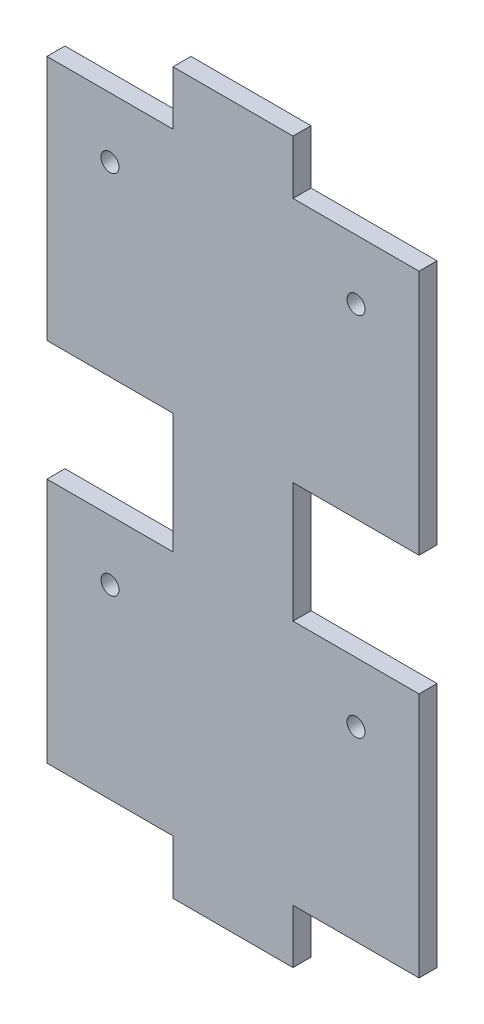
ISO-10303-21;
HEADER;
FILE_DESCRIPTION(('STEP AP214'),'2;1');
FILE_NAME('part.step','',(''),(''),'','','');
FILE_SCHEMA(('AUTOMOTIVE_DESIGN { 1 0 10303 214 1 1 1 1 }'));
ENDSEC;
DATA;
#1=APPLICATION_CONTEXT('core data for automotive mechanical design processes');
#2=APPLICATION_PROTOCOL_DEFINITION('international standard','automotive_design',2000,#1);
#3=PRODUCT_CONTEXT('',#1,'mechanical');
#4=PRODUCT('Part','Part','',(#3));
#5=PRODUCT_RELATED_PRODUCT_CATEGORY('part','',(#4));
#6=PRODUCT_DEFINITION_FORMATION('','',#4);
#7=PRODUCT_DEFINITION_CONTEXT('part definition',#1,'design');
#8=PRODUCT_DEFINITION('design','',#6,#7);
#9=PRODUCT_DEFINITION_SHAPE('','',#8);
#10=(LENGTH_UNIT() NAMED_UNIT(*) SI_UNIT(.MILLI.,.METRE.));
#11=(NAMED_UNIT(*) PLANE_ANGLE_UNIT() SI_UNIT($,.RADIAN.));
#12=(NAMED_UNIT(*) SI_UNIT($,.STERADIAN.) SOLID_ANGLE_UNIT());
#13=UNCERTAINTY_MEASURE_WITH_UNIT(LENGTH_MEASURE(1.E-05),#10,'distance_accuracy_value','');
#14=(GEOMETRIC_REPRESENTATION_CONTEXT(3) GLOBAL_UNCERTAINTY_ASSIGNED_CONTEXT((#13)) GLOBAL_UNIT_ASSIGNED_CONTEXT((#10,
#11,#12)) REPRESENTATION_CONTEXT('',''));
#15=CARTESIAN_POINT('',(0.,0.,0.));
#16=DIRECTION('',(0.,0.,1.));
#17=DIRECTION('',(1.,0.,0.));
#18=AXIS2_PLACEMENT_3D('',#15,#16,#17);
#19=CARTESIAN_POINT('',(31.,0.,3.));
#20=DIRECTION('',(-1.,0.,0.));
#21=DIRECTION('',(0.,0.,1.));
#22=AXIS2_PLACEMENT_3D('',#19,#20,#21);
#23=PLANE('',#22);
#24=DIRECTION('',(0.,1.,0.));
#25=VECTOR('',#24,1.);
#26=CARTESIAN_POINT('',(31.,0.,0.));
#27=LINE('',#26,#25);
#28=CARTESIAN_POINT('',(31.,13.4085885049134,0.));
#29=VERTEX_POINT('',#28);
#30=CARTESIAN_POINT('',(31.,54.4085885049134,0.));
#31=VERTEX_POINT('',#30);
#32=EDGE_CURVE('E221',#29,#31,#27,.T.);
#33=ORIENTED_EDGE('',*,*,#32,.T.);
#34=DIRECTION('',(0.,0.,-1.));
#35=VECTOR('',#34,1.);
#36=CARTESIAN_POINT('',(31.,54.4085885049134,3.));
#37=LINE('',#36,#35);
#38=CARTESIAN_POINT('',(31.,54.4085885049134,3.));
#39=VERTEX_POINT('',#38);
#40=EDGE_CURVE('E11',#39,#31,#37,.T.);
#41=ORIENTED_EDGE('',*,*,#40,.F.);
#42=DIRECTION('',(0.,1.,0.));
#43=VECTOR('',#42,1.);
#44=CARTESIAN_POINT('',(31.,0.,3.));
#45=LINE('',#44,#43);
#46=CARTESIAN_POINT('',(31.,13.4085885049134,3.));
#47=VERTEX_POINT('',#46);
#48=EDGE_CURVE('E362',#47,#39,#45,.T.);
#49=ORIENTED_EDGE('',*,*,#48,.F.);
#50=DIRECTION('',(0.,0.,-1.));
#51=VECTOR('',#50,1.);
#52=CARTESIAN_POINT('',(31.,13.4085885049134,3.));
#53=LINE('',#52,#51);
#54=EDGE_CURVE('E217',#47,#29,#53,.T.);
#55=ORIENTED_EDGE('',*,*,#54,.T.);
#56=EDGE_LOOP('',(#33,#41,#49,#55));
#57=FACE_BOUND('',#56,.T.);
#58=ADVANCED_FACE('F35',(#57),#23,.F.);
#59=CARTESIAN_POINT('',(0.,54.4085885049134,3.));
#60=DIRECTION('',(0.,-1.,0.));
#61=DIRECTION('',(1.,0.,0.));
#62=AXIS2_PLACEMENT_3D('',#59,#60,#61);
#63=PLANE('',#62);
#64=DIRECTION('',(-1.,0.,0.));
#65=VECTOR('',#64,1.);
#66=CARTESIAN_POINT('',(0.,54.4085885049134,0.));
#67=LINE('',#66,#65);
#68=CARTESIAN_POINT('',(10.,54.4085885049134,0.));
#69=VERTEX_POINT('',#68);
#70=EDGE_CURVE('E224',#31,#69,#67,.T.);
#71=ORIENTED_EDGE('',*,*,#70,.T.);
#72=DIRECTION('',(0.,0.,-1.));
#73=VECTOR('',#72,1.);
#74=CARTESIAN_POINT('',(10.,54.4085885049134,3.));
#75=LINE('',#74,#73);
#76=CARTESIAN_POINT('',(10.,54.4085885049134,3.));
#77=VERTEX_POINT('',#76);
#78=EDGE_CURVE('E44',#77,#69,#75,.T.);
#79=ORIENTED_EDGE('',*,*,#78,.F.);
#80=DIRECTION('',(-1.,0.,0.));
#81=VECTOR('',#80,1.);
#82=CARTESIAN_POINT('',(0.,54.4085885049134,3.));
#83=LINE('',#82,#81);
#84=EDGE_CURVE('E130',#39,#77,#83,.T.);
#85=ORIENTED_EDGE('',*,*,#84,.F.);
#86=ORIENTED_EDGE('',*,*,#40,.T.);
#87=EDGE_LOOP('',(#71,#79,#85,#86));
#88=FACE_BOUND('',#87,.T.);
#89=ADVANCED_FACE('F382',(#88),#63,.F.);
#90=CARTESIAN_POINT('',(10.,0.,3.));
#91=DIRECTION('',(-1.,0.,0.));
#92=DIRECTION('',(0.,0.,1.));
#93=AXIS2_PLACEMENT_3D('',#90,#91,#92);
#94=PLANE('',#93);
#95=DIRECTION('',(0.,1.,0.));
#96=VECTOR('',#95,1.);
#97=CARTESIAN_POINT('',(10.,0.,0.));
#98=LINE('',#97,#96);
#99=CARTESIAN_POINT('',(10.,63.4085885049134,0.));
#100=VERTEX_POINT('',#99);
#101=EDGE_CURVE('E226',#69,#100,#98,.T.);
#102=ORIENTED_EDGE('',*,*,#101,.T.);
#103=DIRECTION('',(0.,0.,-1.));
#104=VECTOR('',#103,1.);
#105=CARTESIAN_POINT('',(10.,63.4085885049134,3.));
#106=LINE('',#105,#104);
#107=CARTESIAN_POINT('',(10.,63.4085885049134,3.));
#108=VERTEX_POINT('',#107);
#109=EDGE_CURVE('E307',#108,#100,#106,.T.);
#110=ORIENTED_EDGE('',*,*,#109,.F.);
#111=DIRECTION('',(0.,1.,0.));
#112=VECTOR('',#111,1.);
#113=CARTESIAN_POINT('',(10.,0.,3.));
#114=LINE('',#113,#112);
#115=EDGE_CURVE('E195',#77,#108,#114,.T.);
#116=ORIENTED_EDGE('',*,*,#115,.F.);
#117=ORIENTED_EDGE('',*,*,#78,.T.);
#118=EDGE_LOOP('',(#102,#110,#116,#117));
#119=FACE_BOUND('',#118,.T.);
#120=ADVANCED_FACE('F313',(#119),#94,.F.);
#121=CARTESIAN_POINT('',(0.,63.4085885049134,3.));
#122=DIRECTION('',(0.,-1.,0.));
#123=DIRECTION('',(0.,0.,-1.));
#124=AXIS2_PLACEMENT_3D('',#121,#122,#123);
#125=PLANE('',#124);
#126=DIRECTION('',(-1.,0.,0.));
#127=VECTOR('',#126,1.);
#128=CARTESIAN_POINT('',(0.,63.4085885049134,0.));
#129=LINE('',#128,#127);
#130=CARTESIAN_POINT('',(-10.,63.4085885049134,0.));
#131=VERTEX_POINT('',#130);
#132=EDGE_CURVE('E228',#100,#131,#129,.T.);
#133=ORIENTED_EDGE('',*,*,#132,.T.);
#134=DIRECTION('',(0.,0.,-1.));
#135=VECTOR('',#134,1.);
#136=CARTESIAN_POINT('',(-10.,63.4085885049134,3.));
#137=LINE('',#136,#135);
#138=CARTESIAN_POINT('',(-10.,63.4085885049134,3.));
#139=VERTEX_POINT('',#138);
#140=EDGE_CURVE('E304',#139,#131,#137,.T.);
#141=ORIENTED_EDGE('',*,*,#140,.F.);
#142=DIRECTION('',(-1.,0.,0.));
#143=VECTOR('',#142,1.);
#144=CARTESIAN_POINT('',(0.,63.4085885049134,3.));
#145=LINE('',#144,#143);
#146=EDGE_CURVE('E333',#108,#139,#145,.T.);
#147=ORIENTED_EDGE('',*,*,#146,.F.);
#148=ORIENTED_EDGE('',*,*,#109,.T.);
#149=EDGE_LOOP('',(#133,#141,#147,#148));
#150=FACE_BOUND('',#149,.T.);
#151=ADVANCED_FACE('F323',(#150),#125,.F.);
#152=CARTESIAN_POINT('',(-10.,0.,3.));
#153=DIRECTION('',(1.,0.,0.));
#154=DIRECTION('',(0.,0.,-1.));
#155=AXIS2_PLACEMENT_3D('',#152,#153,#154);
#156=PLANE('',#155);
#157=DIRECTION('',(0.,-1.,0.));
#158=VECTOR('',#157,1.);
#159=CARTESIAN_POINT('',(-10.,0.,0.));
#160=LINE('',#159,#158);
#161=CARTESIAN_POINT('',(-10.,54.4085885049134,0.));
#162=VERTEX_POINT('',#161);
#163=EDGE_CURVE('E231',#131,#162,#160,.T.);
#164=ORIENTED_EDGE('',*,*,#163,.T.);
#165=DIRECTION('',(0.,0.,-1.));
#166=VECTOR('',#165,1.);
#167=CARTESIAN_POINT('',(-10.,54.4085885049134,3.));
#168=LINE('',#167,#166);
#169=CARTESIAN_POINT('',(-10.,54.4085885049134,3.));
#170=VERTEX_POINT('',#169);
#171=EDGE_CURVE('E302',#170,#162,#168,.T.);
#172=ORIENTED_EDGE('',*,*,#171,.F.);
#173=DIRECTION('',(0.,-1.,0.));
#174=VECTOR('',#173,1.);
#175=CARTESIAN_POINT('',(-10.,0.,3.));
#176=LINE('',#175,#174);
#177=EDGE_CURVE('E329',#139,#170,#176,.T.);
#178=ORIENTED_EDGE('',*,*,#177,.F.);
#179=ORIENTED_EDGE('',*,*,#140,.T.);
#180=EDGE_LOOP('',(#164,#172,#178,#179));
#181=FACE_BOUND('',#180,.T.);
#182=ADVANCED_FACE('F327',(#181),#156,.F.);
#183=CARTESIAN_POINT('',(0.,54.4085885049134,3.));
#184=DIRECTION('',(0.,1.,0.));
#185=DIRECTION('',(0.,0.,1.));
#186=AXIS2_PLACEMENT_3D('',#183,#184,#185);
#187=PLANE('',#186);
#188=DIRECTION('',(1.,0.,0.));
#189=VECTOR('',#188,1.);
#190=CARTESIAN_POINT('',(0.,54.4085885049134,0.));
#191=LINE('',#190,#189);
#192=CARTESIAN_POINT('',(-31.,54.4085885049134,0.));
#193=VERTEX_POINT('',#192);
#194=EDGE_CURVE('E234',#193,#162,#191,.T.);
#195=ORIENTED_EDGE('',*,*,#194,.F.);
#196=DIRECTION('',(0.,0.,-1.));
#197=VECTOR('',#196,1.);
#198=CARTESIAN_POINT('',(-31.,54.4085885049134,3.));
#199=LINE('',#198,#197);
#200=CARTESIAN_POINT('',(-31.,54.4085885049134,3.));
#201=VERTEX_POINT('',#200);
#202=EDGE_CURVE('E300',#201,#193,#199,.T.);
#203=ORIENTED_EDGE('',*,*,#202,.F.);
#204=DIRECTION('',(1.,0.,0.));
#205=VECTOR('',#204,1.);
#206=CARTESIAN_POINT('',(0.,54.4085885049134,3.));
#207=LINE('',#206,#205);
#208=EDGE_CURVE('E332',#201,#170,#207,.T.);
#209=ORIENTED_EDGE('',*,*,#208,.T.);
#210=ORIENTED_EDGE('',*,*,#171,.T.);
#211=EDGE_LOOP('',(#195,#203,#209,#210));
#212=FACE_BOUND('',#211,.T.);
#213=ADVANCED_FACE('F391',(#212),#187,.T.);
#214=CARTESIAN_POINT('',(-31.,0.,3.));
#215=DIRECTION('',(-1.,0.,0.));
#216=DIRECTION('',(0.,0.,1.));
#217=AXIS2_PLACEMENT_3D('',#214,#215,#216);
#218=PLANE('',#217);
#219=DIRECTION('',(0.,1.,0.));
#220=VECTOR('',#219,1.);
#221=CARTESIAN_POINT('',(-31.,0.,0.));
#222=LINE('',#221,#220);
#223=CARTESIAN_POINT('',(-31.,13.4085885049134,0.));
#224=VERTEX_POINT('',#223);
#225=EDGE_CURVE('E239',#224,#193,#222,.T.);
#226=ORIENTED_EDGE('',*,*,#225,.F.);
#227=DIRECTION('',(0.,0.,-1.));
#228=VECTOR('',#227,1.);
#229=CARTESIAN_POINT('',(-31.,13.4085885049134,3.));
#230=LINE('',#229,#228);
#231=CARTESIAN_POINT('',(-31.,13.4085885049134,3.));
#232=VERTEX_POINT('',#231);
#233=EDGE_CURVE('E298',#232,#224,#230,.T.);
#234=ORIENTED_EDGE('',*,*,#233,.F.);
#235=DIRECTION('',(0.,1.,0.));
#236=VECTOR('',#235,1.);
#237=CARTESIAN_POINT('',(-31.,0.,3.));
#238=LINE('',#237,#236);
#239=EDGE_CURVE('E337',#232,#201,#238,.T.);
#240=ORIENTED_EDGE('',*,*,#239,.T.);
#241=ORIENTED_EDGE('',*,*,#202,.T.);
#242=EDGE_LOOP('',(#226,#234,#240,#241));
#243=FACE_BOUND('',#242,.T.);
#244=ADVANCED_FACE('F394',(#243),#218,.T.);
#245=CARTESIAN_POINT('',(0.,13.4085885049134,3.));
#246=DIRECTION('',(0.,-1.,0.));
#247=DIRECTION('',(1.,0.,0.));
#248=AXIS2_PLACEMENT_3D('',#245,#246,#247);
#249=PLANE('',#248);
#250=DIRECTION('',(-1.,0.,0.));
#251=VECTOR('',#250,1.);
#252=CARTESIAN_POINT('',(0.,13.4085885049134,0.));
#253=LINE('',#252,#251);
#254=CARTESIAN_POINT('',(-10.,13.4085885049134,0.));
#255=VERTEX_POINT('',#254);
#256=EDGE_CURVE('E242',#255,#224,#253,.T.);
#257=ORIENTED_EDGE('',*,*,#256,.F.);
#258=DIRECTION('',(0.,0.,-1.));
#259=VECTOR('',#258,1.);
#260=CARTESIAN_POINT('',(-10.,13.4085885049134,3.));
#261=LINE('',#260,#259);
#262=CARTESIAN_POINT('',(-10.,13.4085885049134,3.));
#263=VERTEX_POINT('',#262);
#264=EDGE_CURVE('E296',#263,#255,#261,.T.);
#265=ORIENTED_EDGE('',*,*,#264,.F.);
#266=DIRECTION('',(-1.,0.,0.));
#267=VECTOR('',#266,1.);
#268=CARTESIAN_POINT('',(0.,13.4085885049134,3.));
#269=LINE('',#268,#267);
#270=EDGE_CURVE('E343',#263,#232,#269,.T.);
#271=ORIENTED_EDGE('',*,*,#270,.T.);
#272=ORIENTED_EDGE('',*,*,#233,.T.);
#273=EDGE_LOOP('',(#257,#265,#271,#272));
#274=FACE_BOUND('',#273,.T.);
#275=ADVANCED_FACE('F398',(#274),#249,.T.);
#276=CARTESIAN_POINT('',(-10.,-6.59141149508663,0.));
#277=VERTEX_POINT('',#276);
#278=EDGE_CURVE('E236',#255,#277,#160,.T.);
#279=ORIENTED_EDGE('',*,*,#278,.T.);
#280=DIRECTION('',(0.,0.,-1.));
#281=VECTOR('',#280,1.);
#282=CARTESIAN_POINT('',(-10.,-6.59141149508663,3.));
#283=LINE('',#282,#281);
#284=CARTESIAN_POINT('',(-10.,-6.59141149508663,3.));
#285=VERTEX_POINT('',#284);
#286=EDGE_CURVE('E293',#285,#277,#283,.T.);
#287=ORIENTED_EDGE('',*,*,#286,.F.);
#288=EDGE_CURVE('E336',#263,#285,#176,.T.);
#289=ORIENTED_EDGE('',*,*,#288,.F.);
#290=ORIENTED_EDGE('',*,*,#264,.T.);
#291=EDGE_LOOP('',(#279,#287,#289,#290));
#292=FACE_BOUND('',#291,.T.);
#293=ADVANCED_FACE('F402',(#292),#156,.F.);
#294=CARTESIAN_POINT('',(0.,-6.59141149508663,3.));
#295=DIRECTION('',(0.,-1.,0.));
#296=DIRECTION('',(1.,0.,0.));
#297=AXIS2_PLACEMENT_3D('',#294,#295,#296);
#298=PLANE('',#297);
#299=DIRECTION('',(-1.,0.,0.));
#300=VECTOR('',#299,1.);
#301=CARTESIAN_POINT('',(0.,-6.59141149508663,0.));
#302=LINE('',#301,#300);
#303=CARTESIAN_POINT('',(-31.,-6.59141149508663,0.));
#304=VERTEX_POINT('',#303);
#305=EDGE_CURVE('E245',#277,#304,#302,.T.);
#306=ORIENTED_EDGE('',*,*,#305,.T.);
#307=DIRECTION('',(0.,0.,-1.));
#308=VECTOR('',#307,1.);
#309=CARTESIAN_POINT('',(-31.,-6.59141149508663,3.));
#310=LINE('',#309,#308);
#311=CARTESIAN_POINT('',(-31.,-6.59141149508663,3.));
#312=VERTEX_POINT('',#311);
#313=EDGE_CURVE('E290',#312,#304,#310,.T.);
#314=ORIENTED_EDGE('',*,*,#313,.F.);
#315=DIRECTION('',(-1.,0.,0.));
#316=VECTOR('',#315,1.);
#317=CARTESIAN_POINT('',(0.,-6.59141149508663,3.));
#318=LINE('',#317,#316);
#319=EDGE_CURVE('E342',#285,#312,#318,.T.);
#320=ORIENTED_EDGE('',*,*,#319,.F.);
#321=ORIENTED_EDGE('',*,*,#286,.T.);
#322=EDGE_LOOP('',(#306,#314,#320,#321));
#323=FACE_BOUND('',#322,.T.);
#324=ADVANCED_FACE('F403',(#323),#298,.F.);
#325=CARTESIAN_POINT('',(-31.,0.,3.));
#326=DIRECTION('',(1.,0.,0.));
#327=DIRECTION('',(0.,0.,-1.));
#328=AXIS2_PLACEMENT_3D('',#325,#326,#327);
#329=PLANE('',#328);
#330=DIRECTION('',(0.,-1.,0.));
#331=VECTOR('',#330,1.);
#332=CARTESIAN_POINT('',(-31.,0.,0.));
#333=LINE('',#332,#331);
#334=CARTESIAN_POINT('',(-31.,-47.5914114950866,0.));
#335=VERTEX_POINT('',#334);
#336=EDGE_CURVE('E247',#304,#335,#333,.T.);
#337=ORIENTED_EDGE('',*,*,#336,.T.);
#338=DIRECTION('',(0.,0.,-1.));
#339=VECTOR('',#338,1.);
#340=CARTESIAN_POINT('',(-31.,-47.5914114950866,3.));
#341=LINE('',#340,#339);
#342=CARTESIAN_POINT('',(-31.,-47.5914114950866,3.));
#343=VERTEX_POINT('',#342);
#344=EDGE_CURVE('E287',#343,#335,#341,.T.);
#345=ORIENTED_EDGE('',*,*,#344,.F.);
#346=DIRECTION('',(0.,-1.,0.));
#347=VECTOR('',#346,1.);
#348=CARTESIAN_POINT('',(-31.,0.,3.));
#349=LINE('',#348,#347);
#350=EDGE_CURVE('E347',#312,#343,#349,.T.);
#351=ORIENTED_EDGE('',*,*,#350,.F.);
#352=ORIENTED_EDGE('',*,*,#313,.T.);
#353=EDGE_LOOP('',(#337,#345,#351,#352));
#354=FACE_BOUND('',#353,.T.);
#355=ADVANCED_FACE('F406',(#354),#329,.F.);
#356=CARTESIAN_POINT('',(0.,-47.5914114950866,3.));
#357=DIRECTION('',(0.,1.,0.));
#358=DIRECTION('',(0.,0.,1.));
#359=AXIS2_PLACEMENT_3D('',#356,#357,#358);
#360=PLANE('',#359);
#361=DIRECTION('',(1.,0.,0.));
#362=VECTOR('',#361,1.);
#363=CARTESIAN_POINT('',(0.,-47.5914114950866,0.));
#364=LINE('',#363,#362);
#365=CARTESIAN_POINT('',(-10.,-47.5914114950866,0.));
#366=VERTEX_POINT('',#365);
#367=EDGE_CURVE('E249',#335,#366,#364,.T.);
#368=ORIENTED_EDGE('',*,*,#367,.T.);
#369=DIRECTION('',(0.,0.,-1.));
#370=VECTOR('',#369,1.);
#371=CARTESIAN_POINT('',(-10.,-47.5914114950866,3.));
#372=LINE('',#371,#370);
#373=CARTESIAN_POINT('',(-10.,-47.5914114950866,3.));
#374=VERTEX_POINT('',#373);
#375=EDGE_CURVE('E284',#374,#366,#372,.T.);
#376=ORIENTED_EDGE('',*,*,#375,.F.);
#377=DIRECTION('',(1.,0.,0.));
#378=VECTOR('',#377,1.);
#379=CARTESIAN_POINT('',(0.,-47.5914114950866,3.));
#380=LINE('',#379,#378);
#381=EDGE_CURVE('E341',#343,#374,#380,.T.);
#382=ORIENTED_EDGE('',*,*,#381,.F.);
#383=ORIENTED_EDGE('',*,*,#344,.T.);
#384=EDGE_LOOP('',(#368,#376,#382,#383));
#385=FACE_BOUND('',#384,.T.);
#386=ADVANCED_FACE('F410',(#385),#360,.F.);
#387=CARTESIAN_POINT('',(-10.,-56.5914114950866,0.));
#388=VERTEX_POINT('',#387);
#389=EDGE_CURVE('E235',#366,#388,#160,.T.);
#390=ORIENTED_EDGE('',*,*,#389,.T.);
#391=DIRECTION('',(0.,0.,-1.));
#392=VECTOR('',#391,1.);
#393=CARTESIAN_POINT('',(-10.,-56.5914114950866,3.));
#394=LINE('',#393,#392);
#395=CARTESIAN_POINT('',(-10.,-56.5914114950866,3.));
#396=VERTEX_POINT('',#395);
#397=EDGE_CURVE('E281',#396,#388,#394,.T.);
#398=ORIENTED_EDGE('',*,*,#397,.F.);
#399=EDGE_CURVE('E335',#374,#396,#176,.T.);
#400=ORIENTED_EDGE('',*,*,#399,.F.);
#401=ORIENTED_EDGE('',*,*,#375,.T.);
#402=EDGE_LOOP('',(#390,#398,#400,#401));
#403=FACE_BOUND('',#402,.T.);
#404=ADVANCED_FACE('F414',(#403),#156,.F.);
#405=CARTESIAN_POINT('',(0.,-56.5914114950866,3.));
#406=DIRECTION('',(0.,1.,0.));
#407=DIRECTION('',(0.,0.,1.));
#408=AXIS2_PLACEMENT_3D('',#405,#406,#407);
#409=PLANE('',#408);
#410=DIRECTION('',(1.,0.,0.));
#411=VECTOR('',#410,1.);
#412=CARTESIAN_POINT('',(0.,-56.5914114950866,0.));
#413=LINE('',#412,#411);
#414=CARTESIAN_POINT('',(10.,-56.5914114950866,0.));
#415=VERTEX_POINT('',#414);
#416=EDGE_CURVE('E251',#388,#415,#413,.T.);
#417=ORIENTED_EDGE('',*,*,#416,.T.);
#418=DIRECTION('',(0.,0.,-1.));
#419=VECTOR('',#418,1.);
#420=CARTESIAN_POINT('',(10.,-56.5914114950866,3.));
#421=LINE('',#420,#419);
#422=CARTESIAN_POINT('',(10.,-56.5914114950866,3.));
#423=VERTEX_POINT('',#422);
#424=EDGE_CURVE('E278',#423,#415,#421,.T.);
#425=ORIENTED_EDGE('',*,*,#424,.F.);
#426=DIRECTION('',(1.,0.,0.));
#427=VECTOR('',#426,1.);
#428=CARTESIAN_POINT('',(0.,-56.5914114950866,3.));
#429=LINE('',#428,#427);
#430=EDGE_CURVE('E340',#396,#423,#429,.T.);
#431=ORIENTED_EDGE('',*,*,#430,.F.);
#432=ORIENTED_EDGE('',*,*,#397,.T.);
#433=EDGE_LOOP('',(#417,#425,#431,#432));
#434=FACE_BOUND('',#433,.T.);
#435=ADVANCED_FACE('F418',(#434),#409,.F.);
#436=CARTESIAN_POINT('',(10.,-47.5914114950866,0.));
#437=VERTEX_POINT('',#436);
#438=EDGE_CURVE('E229',#415,#437,#98,.T.);
#439=ORIENTED_EDGE('',*,*,#438,.T.);
#440=DIRECTION('',(0.,0.,-1.));
#441=VECTOR('',#440,1.);
#442=CARTESIAN_POINT('',(10.,-47.5914114950866,3.));
#443=LINE('',#442,#441);
#444=CARTESIAN_POINT('',(10.,-47.5914114950866,3.));
#445=VERTEX_POINT('',#444);
#446=EDGE_CURVE('E276',#445,#437,#443,.T.);
#447=ORIENTED_EDGE('',*,*,#446,.F.);
#448=EDGE_CURVE('E194',#423,#445,#114,.T.);
#449=ORIENTED_EDGE('',*,*,#448,.F.);
#450=ORIENTED_EDGE('',*,*,#424,.T.);
#451=EDGE_LOOP('',(#439,#447,#449,#450));
#452=FACE_BOUND('',#451,.T.);
#453=ADVANCED_FACE('F422',(#452),#94,.F.);
#454=CARTESIAN_POINT('',(0.,-47.5914114950866,3.));
#455=DIRECTION('',(0.,-1.,0.));
#456=DIRECTION('',(0.,0.,-1.));
#457=AXIS2_PLACEMENT_3D('',#454,#455,#456);
#458=PLANE('',#457);
#459=DIRECTION('',(-1.,0.,0.));
#460=VECTOR('',#459,1.);
#461=CARTESIAN_POINT('',(0.,-47.5914114950866,0.));
#462=LINE('',#461,#460);
#463=CARTESIAN_POINT('',(31.,-47.5914114950866,0.));
#464=VERTEX_POINT('',#463);
#465=EDGE_CURVE('E253',#464,#437,#462,.T.);
#466=ORIENTED_EDGE('',*,*,#465,.F.);
#467=DIRECTION('',(0.,0.,-1.));
#468=VECTOR('',#467,1.);
#469=CARTESIAN_POINT('',(31.,-47.5914114950866,3.));
#470=LINE('',#469,#468);
#471=CARTESIAN_POINT('',(31.,-47.5914114950866,3.));
#472=VERTEX_POINT('',#471);
#473=EDGE_CURVE('E274',#472,#464,#470,.T.);
#474=ORIENTED_EDGE('',*,*,#473,.F.);
#475=DIRECTION('',(-1.,0.,0.));
#476=VECTOR('',#475,1.);
#477=CARTESIAN_POINT('',(0.,-47.5914114950866,3.));
#478=LINE('',#477,#476);
#479=EDGE_CURVE('E203',#472,#445,#478,.T.);
#480=ORIENTED_EDGE('',*,*,#479,.T.);
#481=ORIENTED_EDGE('',*,*,#446,.T.);
#482=EDGE_LOOP('',(#466,#474,#480,#481));
#483=FACE_BOUND('',#482,.T.);
#484=ADVANCED_FACE('F424',(#483),#458,.T.);
#485=CARTESIAN_POINT('',(31.,0.,3.));
#486=DIRECTION('',(1.,0.,0.));
#487=DIRECTION('',(0.,0.,-1.));
#488=AXIS2_PLACEMENT_3D('',#485,#486,#487);
#489=PLANE('',#488);
#490=DIRECTION('',(0.,-1.,0.));
#491=VECTOR('',#490,1.);
#492=CARTESIAN_POINT('',(31.,0.,0.));
#493=LINE('',#492,#491);
#494=CARTESIAN_POINT('',(31.,-6.59141149508663,0.));
#495=VERTEX_POINT('',#494);
#496=EDGE_CURVE('E256',#495,#464,#493,.T.);
#497=ORIENTED_EDGE('',*,*,#496,.F.);
#498=DIRECTION('',(0.,0.,-1.));
#499=VECTOR('',#498,1.);
#500=CARTESIAN_POINT('',(31.,-6.59141149508663,3.));
#501=LINE('',#500,#499);
#502=CARTESIAN_POINT('',(31.,-6.59141149508663,3.));
#503=VERTEX_POINT('',#502);
#504=EDGE_CURVE('E188',#503,#495,#501,.T.);
#505=ORIENTED_EDGE('',*,*,#504,.F.);
#506=DIRECTION('',(0.,-1.,0.));
#507=VECTOR('',#506,1.);
#508=CARTESIAN_POINT('',(31.,0.,3.));
#509=LINE('',#508,#507);
#510=EDGE_CURVE('E201',#503,#472,#509,.T.);
#511=ORIENTED_EDGE('',*,*,#510,.T.);
#512=ORIENTED_EDGE('',*,*,#473,.T.);
#513=EDGE_LOOP('',(#497,#505,#511,#512));
#514=FACE_BOUND('',#513,.T.);
#515=ADVANCED_FACE('F427',(#514),#489,.T.);
#516=CARTESIAN_POINT('',(0.,-6.59141149508664,3.));
#517=DIRECTION('',(0.,1.,0.));
#518=DIRECTION('',(-1.,0.,0.));
#519=AXIS2_PLACEMENT_3D('',#516,#517,#518);
#520=PLANE('',#519);
#521=DIRECTION('',(1.,0.,0.));
#522=VECTOR('',#521,1.);
#523=CARTESIAN_POINT('',(0.,-6.59141149508664,0.));
#524=LINE('',#523,#522);
#525=CARTESIAN_POINT('',(10.,-6.59141149508663,0.));
#526=VERTEX_POINT('',#525);
#527=EDGE_CURVE('E187',#526,#495,#524,.T.);
#528=ORIENTED_EDGE('',*,*,#527,.F.);
#529=DIRECTION('',(0.,0.,-1.));
#530=VECTOR('',#529,1.);
#531=CARTESIAN_POINT('',(10.,-6.59141149508663,3.));
#532=LINE('',#531,#530);
#533=CARTESIAN_POINT('',(10.,-6.59141149508663,3.));
#534=VERTEX_POINT('',#533);
#535=EDGE_CURVE('E181',#534,#526,#532,.T.);
#536=ORIENTED_EDGE('',*,*,#535,.F.);
#537=DIRECTION('',(1.,0.,0.));
#538=VECTOR('',#537,1.);
#539=CARTESIAN_POINT('',(0.,-6.59141149508664,3.));
#540=LINE('',#539,#538);
#541=EDGE_CURVE('E185',#534,#503,#540,.T.);
#542=ORIENTED_EDGE('',*,*,#541,.T.);
#543=ORIENTED_EDGE('',*,*,#504,.T.);
#544=EDGE_LOOP('',(#528,#536,#542,#543));
#545=FACE_BOUND('',#544,.T.);
#546=ADVANCED_FACE('F183',(#545),#520,.T.);
#547=CARTESIAN_POINT('',(10.,13.4085885049134,0.));
#548=VERTEX_POINT('',#547);
#549=EDGE_CURVE('E116',#526,#548,#98,.T.);
#550=ORIENTED_EDGE('',*,*,#549,.T.);
#551=DIRECTION('',(0.,0.,-1.));
#552=VECTOR('',#551,1.);
#553=CARTESIAN_POINT('',(10.,13.4085885049134,3.));
#554=LINE('',#553,#552);
#555=CARTESIAN_POINT('',(10.,13.4085885049134,3.));
#556=VERTEX_POINT('',#555);
#557=EDGE_CURVE('E189',#556,#548,#554,.T.);
#558=ORIENTED_EDGE('',*,*,#557,.F.);
#559=EDGE_CURVE('E191',#534,#556,#114,.T.);
#560=ORIENTED_EDGE('',*,*,#559,.F.);
#561=ORIENTED_EDGE('',*,*,#535,.T.);
#562=EDGE_LOOP('',(#550,#558,#560,#561));
#563=FACE_BOUND('',#562,.T.);
#564=ADVANCED_FACE('F192',(#563),#94,.F.);
#565=CARTESIAN_POINT('',(-20.5,-16.5914114950866,3.));
#566=DIRECTION('',(0.,0.,-1.));
#567=DIRECTION('',(-1.,0.,0.));
#568=AXIS2_PLACEMENT_3D('',#565,#566,#567);
#569=CYLINDRICAL_SURFACE('',#568,1.5);
#570=CARTESIAN_POINT('',(-20.5,-16.5914114950866,3.));
#571=DIRECTION('',(0.,0.,1.));
#572=DIRECTION('',(1.,0.,0.));
#573=AXIS2_PLACEMENT_3D('',#570,#571,#572);
#574=CIRCLE('',#573,1.5);
#575=CARTESIAN_POINT('',(-19.,-16.5914114950866,3.));
#576=VERTEX_POINT('',#575);
#577=EDGE_CURVE('E211',#576,#576,#574,.T.);
#578=ORIENTED_EDGE('',*,*,#577,.T.);
#579=EDGE_LOOP('',(#578));
#580=FACE_BOUND('',#579,.T.);
#581=CARTESIAN_POINT('',(-20.5,-16.5914114950866,0.));
#582=DIRECTION('',(0.,0.,1.));
#583=DIRECTION('',(1.,0.,0.));
#584=AXIS2_PLACEMENT_3D('',#581,#582,#583);
#585=CIRCLE('',#584,1.5);
#586=CARTESIAN_POINT('',(-19.,-16.5914114950866,0.));
#587=VERTEX_POINT('',#586);
#588=EDGE_CURVE('E264',#587,#587,#585,.T.);
#589=ORIENTED_EDGE('',*,*,#588,.F.);
#590=EDGE_LOOP('',(#589));
#591=FACE_BOUND('',#590,.T.);
#592=ADVANCED_FACE('F435',(#580,#591),#569,.F.);
#593=CARTESIAN_POINT('',(20.5,-16.5914114950866,3.));
#594=DIRECTION('',(0.,0.,-1.));
#595=DIRECTION('',(-1.,0.,0.));
#596=AXIS2_PLACEMENT_3D('',#593,#594,#595);
#597=CYLINDRICAL_SURFACE('',#596,1.5);
#598=CARTESIAN_POINT('',(20.5,-16.5914114950866,3.));
#599=DIRECTION('',(0.,0.,1.));
#600=DIRECTION('',(1.,0.,0.));
#601=AXIS2_PLACEMENT_3D('',#598,#599,#600);
#602=CIRCLE('',#601,1.5);
#603=CARTESIAN_POINT('',(22.,-16.5914114950866,3.));
#604=VERTEX_POINT('',#603);
#605=EDGE_CURVE('E208',#604,#604,#602,.T.);
#606=ORIENTED_EDGE('',*,*,#605,.T.);
#607=EDGE_LOOP('',(#606));
#608=FACE_BOUND('',#607,.T.);
#609=CARTESIAN_POINT('',(20.5,-16.5914114950866,0.));
#610=DIRECTION('',(0.,0.,1.));
#611=DIRECTION('',(1.,0.,0.));
#612=AXIS2_PLACEMENT_3D('',#609,#610,#611);
#613=CIRCLE('',#612,1.5);
#614=CARTESIAN_POINT('',(22.,-16.5914114950866,0.));
#615=VERTEX_POINT('',#614);
#616=EDGE_CURVE('E261',#615,#615,#613,.T.);
#617=ORIENTED_EDGE('',*,*,#616,.F.);
#618=EDGE_LOOP('',(#617));
#619=FACE_BOUND('',#618,.T.);
#620=ADVANCED_FACE('F439',(#608,#619),#597,.F.);
#621=CARTESIAN_POINT('',(0.,13.4085885049134,3.));
#622=DIRECTION('',(0.,1.,0.));
#623=DIRECTION('',(-1.,0.,0.));
#624=AXIS2_PLACEMENT_3D('',#621,#622,#623);
#625=PLANE('',#624);
#626=DIRECTION('',(1.,0.,0.));
#627=VECTOR('',#626,1.);
#628=CARTESIAN_POINT('',(0.,13.4085885049134,0.));
#629=LINE('',#628,#627);
#630=EDGE_CURVE('E122',#548,#29,#629,.T.);
#631=ORIENTED_EDGE('',*,*,#630,.T.);
#632=ORIENTED_EDGE('',*,*,#54,.F.);
#633=DIRECTION('',(1.,0.,0.));
#634=VECTOR('',#633,1.);
#635=CARTESIAN_POINT('',(0.,13.4085885049134,3.));
#636=LINE('',#635,#634);
#637=EDGE_CURVE('E52',#556,#47,#636,.T.);
#638=ORIENTED_EDGE('',*,*,#637,.F.);
#639=ORIENTED_EDGE('',*,*,#557,.T.);
#640=EDGE_LOOP('',(#631,#632,#638,#639));
#641=FACE_BOUND('',#640,.T.);
#642=ADVANCED_FACE('F436',(#641),#625,.F.);
#643=CARTESIAN_POINT('',(20.5,44.4085885049134,3.));
#644=DIRECTION('',(0.,0.,-1.));
#645=DIRECTION('',(-1.,0.,0.));
#646=AXIS2_PLACEMENT_3D('',#643,#644,#645);
#647=CYLINDRICAL_SURFACE('',#646,1.5);
#648=CARTESIAN_POINT('',(20.5,44.4085885049134,3.));
#649=DIRECTION('',(0.,0.,1.));
#650=DIRECTION('',(1.,0.,0.));
#651=AXIS2_PLACEMENT_3D('',#648,#649,#650);
#652=CIRCLE('',#651,1.5);
#653=CARTESIAN_POINT('',(22.,44.4085885049134,3.));
#654=VERTEX_POINT('',#653);
#655=EDGE_CURVE('E270',#654,#654,#652,.T.);
#656=ORIENTED_EDGE('',*,*,#655,.T.);
#657=EDGE_LOOP('',(#656));
#658=FACE_BOUND('',#657,.T.);
#659=CARTESIAN_POINT('',(20.5,44.4085885049134,0.));
#660=DIRECTION('',(0.,0.,1.));
#661=DIRECTION('',(1.,0.,0.));
#662=AXIS2_PLACEMENT_3D('',#659,#660,#661);
#663=CIRCLE('',#662,1.5);
#664=CARTESIAN_POINT('',(22.,44.4085885049134,0.));
#665=VERTEX_POINT('',#664);
#666=EDGE_CURVE('E218',#665,#665,#663,.T.);
#667=ORIENTED_EDGE('',*,*,#666,.F.);
#668=EDGE_LOOP('',(#667));
#669=FACE_BOUND('',#668,.T.);
#670=ADVANCED_FACE('F37',(#658,#669),#647,.F.);
#671=CARTESIAN_POINT('',(-20.5,44.4085885049134,3.));
#672=DIRECTION('',(0.,0.,-1.));
#673=DIRECTION('',(-1.,0.,0.));
#674=AXIS2_PLACEMENT_3D('',#671,#672,#673);
#675=CYLINDRICAL_SURFACE('',#674,1.5);
#676=CARTESIAN_POINT('',(-20.5,44.4085885049134,3.));
#677=DIRECTION('',(0.,0.,1.));
#678=DIRECTION('',(1.,0.,0.));
#679=AXIS2_PLACEMENT_3D('',#676,#677,#678);
#680=CIRCLE('',#679,1.5);
#681=CARTESIAN_POINT('',(-19.,44.4085885049134,3.));
#682=VERTEX_POINT('',#681);
#683=EDGE_CURVE('E214',#682,#682,#680,.T.);
#684=ORIENTED_EDGE('',*,*,#683,.T.);
#685=EDGE_LOOP('',(#684));
#686=FACE_BOUND('',#685,.T.);
#687=CARTESIAN_POINT('',(-20.5,44.4085885049134,0.));
#688=DIRECTION('',(0.,0.,1.));
#689=DIRECTION('',(1.,0.,0.));
#690=AXIS2_PLACEMENT_3D('',#687,#688,#689);
#691=CIRCLE('',#690,1.5);
#692=CARTESIAN_POINT('',(-19.,44.4085885049134,0.));
#693=VERTEX_POINT('',#692);
#694=EDGE_CURVE('E267',#693,#693,#691,.T.);
#695=ORIENTED_EDGE('',*,*,#694,.F.);
#696=EDGE_LOOP('',(#695));
#697=FACE_BOUND('',#696,.T.);
#698=ADVANCED_FACE('F371',(#686,#697),#675,.F.);
#699=CARTESIAN_POINT('',(0.,0.,3.));
#700=DIRECTION('',(0.,0.,1.));
#701=DIRECTION('',(1.,0.,0.));
#702=AXIS2_PLACEMENT_3D('',#699,#700,#701);
#703=PLANE('',#702);
#704=ORIENTED_EDGE('',*,*,#655,.F.);
#705=EDGE_LOOP('',(#704));
#706=FACE_BOUND('',#705,.T.);
#707=ORIENTED_EDGE('',*,*,#48,.T.);
#708=ORIENTED_EDGE('',*,*,#84,.T.);
#709=ORIENTED_EDGE('',*,*,#115,.T.);
#710=ORIENTED_EDGE('',*,*,#146,.T.);
#711=ORIENTED_EDGE('',*,*,#177,.T.);
#712=ORIENTED_EDGE('',*,*,#208,.F.);
#713=ORIENTED_EDGE('',*,*,#239,.F.);
#714=ORIENTED_EDGE('',*,*,#270,.F.);
#715=ORIENTED_EDGE('',*,*,#288,.T.);
#716=ORIENTED_EDGE('',*,*,#319,.T.);
#717=ORIENTED_EDGE('',*,*,#350,.T.);
#718=ORIENTED_EDGE('',*,*,#381,.T.);
#719=ORIENTED_EDGE('',*,*,#399,.T.);
#720=ORIENTED_EDGE('',*,*,#430,.T.);
#721=ORIENTED_EDGE('',*,*,#448,.T.);
#722=ORIENTED_EDGE('',*,*,#479,.F.);
#723=ORIENTED_EDGE('',*,*,#510,.F.);
#724=ORIENTED_EDGE('',*,*,#541,.F.);
#725=ORIENTED_EDGE('',*,*,#559,.T.);
#726=ORIENTED_EDGE('',*,*,#637,.T.);
#727=EDGE_LOOP('',(#707,#708,#709,#710,#711,#712,#713,#714,#715,#716,#717,#718,#719,#720,#721,
#722,#723,#724,#725,#726));
#728=FACE_BOUND('',#727,.T.);
#729=ORIENTED_EDGE('',*,*,#605,.F.);
#730=EDGE_LOOP('',(#729));
#731=FACE_BOUND('',#730,.T.);
#732=ORIENTED_EDGE('',*,*,#577,.F.);
#733=EDGE_LOOP('',(#732));
#734=FACE_BOUND('',#733,.T.);
#735=ORIENTED_EDGE('',*,*,#683,.F.);
#736=EDGE_LOOP('',(#735));
#737=FACE_BOUND('',#736,.T.);
#738=ADVANCED_FACE('F197',(#706,#728,#731,#734,#737),#703,.T.);
#739=CARTESIAN_POINT('',(0.,0.,0.));
#740=DIRECTION('',(0.,0.,1.));
#741=DIRECTION('',(1.,0.,0.));
#742=AXIS2_PLACEMENT_3D('',#739,#740,#741);
#743=PLANE('',#742);
#744=ORIENTED_EDGE('',*,*,#666,.T.);
#745=EDGE_LOOP('',(#744));
#746=FACE_BOUND('',#745,.T.);
#747=ORIENTED_EDGE('',*,*,#32,.F.);
#748=ORIENTED_EDGE('',*,*,#630,.F.);
#749=ORIENTED_EDGE('',*,*,#549,.F.);
#750=ORIENTED_EDGE('',*,*,#527,.T.);
#751=ORIENTED_EDGE('',*,*,#496,.T.);
#752=ORIENTED_EDGE('',*,*,#465,.T.);
#753=ORIENTED_EDGE('',*,*,#438,.F.);
#754=ORIENTED_EDGE('',*,*,#416,.F.);
#755=ORIENTED_EDGE('',*,*,#389,.F.);
#756=ORIENTED_EDGE('',*,*,#367,.F.);
#757=ORIENTED_EDGE('',*,*,#336,.F.);
#758=ORIENTED_EDGE('',*,*,#305,.F.);
#759=ORIENTED_EDGE('',*,*,#278,.F.);
#760=ORIENTED_EDGE('',*,*,#256,.T.);
#761=ORIENTED_EDGE('',*,*,#225,.T.);
#762=ORIENTED_EDGE('',*,*,#194,.T.);
#763=ORIENTED_EDGE('',*,*,#163,.F.);
#764=ORIENTED_EDGE('',*,*,#132,.F.);
#765=ORIENTED_EDGE('',*,*,#101,.F.);
#766=ORIENTED_EDGE('',*,*,#70,.F.);
#767=EDGE_LOOP('',(#747,#748,#749,#750,#751,#752,#753,#754,#755,#756,#757,#758,#759,#760,#761,
#762,#763,#764,#765,#766));
#768=FACE_BOUND('',#767,.T.);
#769=ORIENTED_EDGE('',*,*,#616,.T.);
#770=EDGE_LOOP('',(#769));
#771=FACE_BOUND('',#770,.T.);
#772=ORIENTED_EDGE('',*,*,#588,.T.);
#773=EDGE_LOOP('',(#772));
#774=FACE_BOUND('',#773,.T.);
#775=ORIENTED_EDGE('',*,*,#694,.T.);
#776=EDGE_LOOP('',(#775));
#777=FACE_BOUND('',#776,.T.);
#778=ADVANCED_FACE('F318',(#746,#768,#771,#774,#777),#743,.F.);
#779=CLOSED_SHELL('',(#58,#89,#120,#151,#182,#213,#244,#275,#293,#324,#355,#386,#404,#435,#453,
#484,#515,#546,#564,#592,#620,#642,#670,#698,#738,#778));
#780=MANIFOLD_SOLID_BREP('B2',#779);
#781=ADVANCED_BREP_SHAPE_REPRESENTATION('',(#18,#780),#14);
#782=SHAPE_DEFINITION_REPRESENTATION(#9,#781);
ENDSEC;
END-ISO-10303-21;
